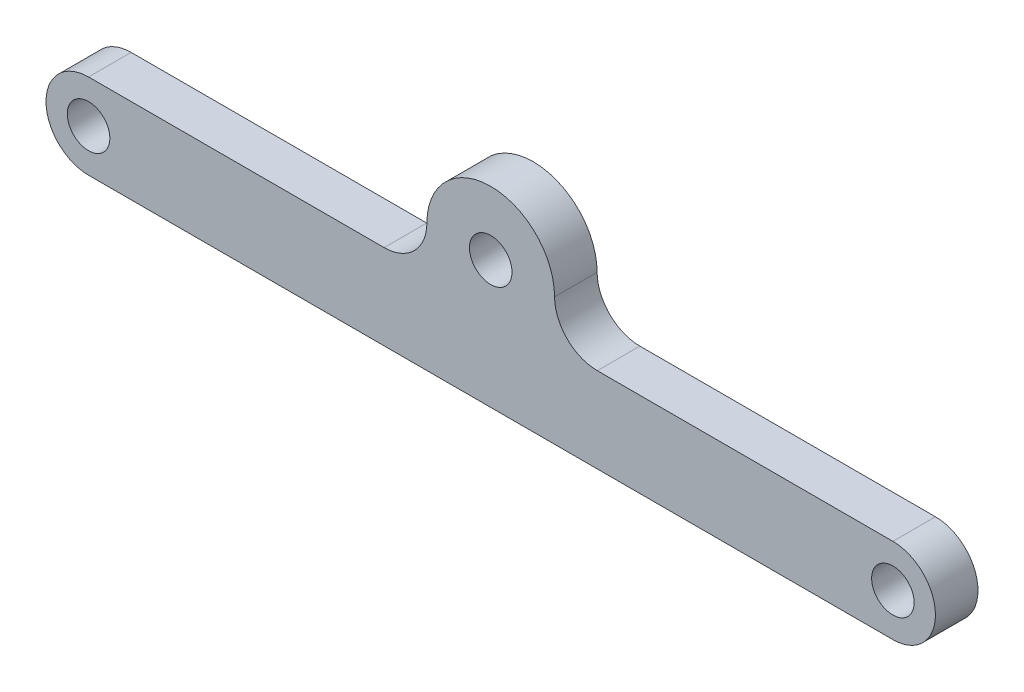
ISO-10303-21;
HEADER;
FILE_DESCRIPTION(('STEP AP214'),'2;1');
FILE_NAME('part.step','',(''),(''),'','','');
FILE_SCHEMA(('AUTOMOTIVE_DESIGN { 1 0 10303 214 1 1 1 1 }'));
ENDSEC;
DATA;
#1=APPLICATION_CONTEXT('core data for automotive mechanical design processes');
#2=APPLICATION_PROTOCOL_DEFINITION('international standard','automotive_design',2000,#1);
#3=PRODUCT_CONTEXT('',#1,'mechanical');
#4=PRODUCT('Part','Part','',(#3));
#5=PRODUCT_RELATED_PRODUCT_CATEGORY('part','',(#4));
#6=PRODUCT_DEFINITION_FORMATION('','',#4);
#7=PRODUCT_DEFINITION_CONTEXT('part definition',#1,'design');
#8=PRODUCT_DEFINITION('design','',#6,#7);
#9=PRODUCT_DEFINITION_SHAPE('','',#8);
#10=(LENGTH_UNIT() NAMED_UNIT(*) SI_UNIT(.MILLI.,.METRE.));
#11=(NAMED_UNIT(*) PLANE_ANGLE_UNIT() SI_UNIT($,.RADIAN.));
#12=(NAMED_UNIT(*) SI_UNIT($,.STERADIAN.) SOLID_ANGLE_UNIT());
#13=UNCERTAINTY_MEASURE_WITH_UNIT(LENGTH_MEASURE(1.E-05),#10,'distance_accuracy_value','');
#14=(GEOMETRIC_REPRESENTATION_CONTEXT(3) GLOBAL_UNCERTAINTY_ASSIGNED_CONTEXT((#13)) GLOBAL_UNIT_ASSIGNED_CONTEXT((#10,
#11,#12)) REPRESENTATION_CONTEXT('',''));
#15=CARTESIAN_POINT('',(0.,0.,0.));
#16=DIRECTION('',(0.,0.,1.));
#17=DIRECTION('',(1.,0.,0.));
#18=AXIS2_PLACEMENT_3D('',#15,#16,#17);
#19=CARTESIAN_POINT('',(31.8097299316788,25.45987039092,12.7));
#20=DIRECTION('',(0.,0.,1.));
#21=DIRECTION('',(1.,0.,0.));
#22=AXIS2_PLACEMENT_3D('',#19,#20,#21);
#23=PLANE('',#22);
#24=CARTESIAN_POINT('',(120.015,0.,12.7));
#25=DIRECTION('',(0.,0.,1.));
#26=DIRECTION('',(1.,0.,0.));
#27=AXIS2_PLACEMENT_3D('',#24,#25,#26);
#28=CIRCLE('',#27,6.35);
#29=CARTESIAN_POINT('',(126.365,0.,12.7));
#30=VERTEX_POINT('',#29);
#31=EDGE_CURVE('E217',#30,#30,#28,.T.);
#32=ORIENTED_EDGE('',*,*,#31,.F.);
#33=EDGE_LOOP('',(#32));
#34=FACE_BOUND('',#33,.T.);
#35=CARTESIAN_POINT('',(31.8097299316788,25.45987039092,12.7));
#36=DIRECTION('',(0.,0.,-1.));
#37=DIRECTION('',(1.,0.,0.));
#38=AXIS2_PLACEMENT_3D('',#35,#36,#37);
#39=CIRCLE('',#38,12.7598703909204);
#40=CARTESIAN_POINT('',(31.8097331654699,12.7,12.7));
#41=VERTEX_POINT('',#40);
#42=CARTESIAN_POINT('',(19.05,25.3999999999999,12.7));
#43=VERTEX_POINT('',#42);
#44=EDGE_CURVE('E168',#41,#43,#39,.T.);
#45=ORIENTED_EDGE('',*,*,#44,.T.);
#46=CARTESIAN_POINT('',(0.,25.4,12.7));
#47=DIRECTION('',(0.,0.,1.));
#48=DIRECTION('',(1.,0.,0.));
#49=AXIS2_PLACEMENT_3D('',#46,#47,#48);
#50=CIRCLE('',#49,19.05);
#51=CARTESIAN_POINT('',(-19.05,25.3999999999999,12.7));
#52=VERTEX_POINT('',#51);
#53=EDGE_CURVE('E104',#43,#52,#50,.T.);
#54=ORIENTED_EDGE('',*,*,#53,.T.);
#55=CARTESIAN_POINT('',(-31.8097299316788,25.45987039092,12.7));
#56=DIRECTION('',(0.,0.,-1.));
#57=DIRECTION('',(-1.,0.,0.));
#58=AXIS2_PLACEMENT_3D('',#55,#56,#57);
#59=CIRCLE('',#58,12.7598703909204);
#60=CARTESIAN_POINT('',(-31.8097331654699,12.7,12.7));
#61=VERTEX_POINT('',#60);
#62=EDGE_CURVE('E189',#52,#61,#59,.T.);
#63=ORIENTED_EDGE('',*,*,#62,.T.);
#64=DIRECTION('',(-1.,0.,0.));
#65=VECTOR('',#64,1.);
#66=CARTESIAN_POINT('',(-120.015,12.7,12.7));
#67=LINE('',#66,#65);
#68=CARTESIAN_POINT('',(-120.015,12.7,12.7));
#69=VERTEX_POINT('',#68);
#70=EDGE_CURVE('E203',#61,#69,#67,.T.);
#71=ORIENTED_EDGE('',*,*,#70,.T.);
#72=CARTESIAN_POINT('',(-120.015,0.,12.7));
#73=DIRECTION('',(0.,0.,1.));
#74=DIRECTION('',(1.,0.,0.));
#75=AXIS2_PLACEMENT_3D('',#72,#73,#74);
#76=CIRCLE('',#75,12.7);
#77=CARTESIAN_POINT('',(-120.015,-12.7,12.7));
#78=VERTEX_POINT('',#77);
#79=EDGE_CURVE('E123',#69,#78,#76,.T.);
#80=ORIENTED_EDGE('',*,*,#79,.T.);
#81=DIRECTION('',(1.,0.,0.));
#82=VECTOR('',#81,1.);
#83=CARTESIAN_POINT('',(-120.015,-12.7,12.7));
#84=LINE('',#83,#82);
#85=CARTESIAN_POINT('',(120.015,-12.6999999999999,12.7));
#86=VERTEX_POINT('',#85);
#87=EDGE_CURVE('E117',#78,#86,#84,.T.);
#88=ORIENTED_EDGE('',*,*,#87,.T.);
#89=CARTESIAN_POINT('',(120.015,0.,12.7));
#90=DIRECTION('',(0.,0.,1.));
#91=DIRECTION('',(1.,0.,0.));
#92=AXIS2_PLACEMENT_3D('',#89,#90,#91);
#93=CIRCLE('',#92,12.7);
#94=CARTESIAN_POINT('',(120.015,12.7,12.7));
#95=VERTEX_POINT('',#94);
#96=EDGE_CURVE('E121',#86,#95,#93,.T.);
#97=ORIENTED_EDGE('',*,*,#96,.T.);
#98=DIRECTION('',(-1.,0.,0.));
#99=VECTOR('',#98,1.);
#100=CARTESIAN_POINT('',(31.8097331654699,12.7,12.7));
#101=LINE('',#100,#99);
#102=EDGE_CURVE('E61',#95,#41,#101,.T.);
#103=ORIENTED_EDGE('',*,*,#102,.T.);
#104=EDGE_LOOP('',(#45,#54,#63,#71,#80,#88,#97,#103));
#105=FACE_BOUND('',#104,.T.);
#106=CARTESIAN_POINT('',(-120.015,0.,12.7));
#107=DIRECTION('',(0.,0.,1.));
#108=DIRECTION('',(1.,0.,0.));
#109=AXIS2_PLACEMENT_3D('',#106,#107,#108);
#110=CIRCLE('',#109,6.35);
#111=CARTESIAN_POINT('',(-113.665,0.,12.7));
#112=VERTEX_POINT('',#111);
#113=EDGE_CURVE('E150',#112,#112,#110,.T.);
#114=ORIENTED_EDGE('',*,*,#113,.F.);
#115=EDGE_LOOP('',(#114));
#116=FACE_BOUND('',#115,.T.);
#117=CARTESIAN_POINT('',(0.,25.4,12.7));
#118=DIRECTION('',(0.,0.,1.));
#119=DIRECTION('',(1.,0.,0.));
#120=AXIS2_PLACEMENT_3D('',#117,#118,#119);
#121=CIRCLE('',#120,6.35);
#122=CARTESIAN_POINT('',(6.35,25.4,12.7));
#123=VERTEX_POINT('',#122);
#124=EDGE_CURVE('E225',#123,#123,#121,.T.);
#125=ORIENTED_EDGE('',*,*,#124,.F.);
#126=EDGE_LOOP('',(#125));
#127=FACE_BOUND('',#126,.T.);
#128=ADVANCED_FACE('F43',(#34,#105,#116,#127),#23,.T.);
#129=CARTESIAN_POINT('',(31.8097299316788,25.45987039092,0.));
#130=DIRECTION('',(0.,0.,1.));
#131=DIRECTION('',(1.,0.,0.));
#132=AXIS2_PLACEMENT_3D('',#129,#130,#131);
#133=PLANE('',#132);
#134=CARTESIAN_POINT('',(31.8097299316788,25.45987039092,0.));
#135=DIRECTION('',(0.,0.,-1.));
#136=DIRECTION('',(1.,0.,0.));
#137=AXIS2_PLACEMENT_3D('',#134,#135,#136);
#138=CIRCLE('',#137,12.7598703909204);
#139=CARTESIAN_POINT('',(31.8097331654699,12.7,0.));
#140=VERTEX_POINT('',#139);
#141=CARTESIAN_POINT('',(19.05,25.3999999999999,0.));
#142=VERTEX_POINT('',#141);
#143=EDGE_CURVE('E145',#140,#142,#138,.T.);
#144=ORIENTED_EDGE('',*,*,#143,.F.);
#145=DIRECTION('',(-1.,0.,0.));
#146=VECTOR('',#145,1.);
#147=CARTESIAN_POINT('',(31.8097331654699,12.7,0.));
#148=LINE('',#147,#146);
#149=CARTESIAN_POINT('',(120.015,12.7,0.));
#150=VERTEX_POINT('',#149);
#151=EDGE_CURVE('E96',#150,#140,#148,.T.);
#152=ORIENTED_EDGE('',*,*,#151,.F.);
#153=CARTESIAN_POINT('',(120.015,0.,0.));
#154=DIRECTION('',(0.,0.,1.));
#155=DIRECTION('',(1.,0.,0.));
#156=AXIS2_PLACEMENT_3D('',#153,#154,#155);
#157=CIRCLE('',#156,12.7);
#158=CARTESIAN_POINT('',(120.015,-12.6999999999999,0.));
#159=VERTEX_POINT('',#158);
#160=EDGE_CURVE('E90',#159,#150,#157,.T.);
#161=ORIENTED_EDGE('',*,*,#160,.F.);
#162=DIRECTION('',(1.,0.,0.));
#163=VECTOR('',#162,1.);
#164=CARTESIAN_POINT('',(-120.015,-12.7,0.));
#165=LINE('',#164,#163);
#166=CARTESIAN_POINT('',(-120.015,-12.7,0.));
#167=VERTEX_POINT('',#166);
#168=EDGE_CURVE('E132',#167,#159,#165,.T.);
#169=ORIENTED_EDGE('',*,*,#168,.F.);
#170=CARTESIAN_POINT('',(-120.015,0.,0.));
#171=DIRECTION('',(0.,0.,1.));
#172=DIRECTION('',(1.,0.,0.));
#173=AXIS2_PLACEMENT_3D('',#170,#171,#172);
#174=CIRCLE('',#173,12.7);
#175=CARTESIAN_POINT('',(-120.015,12.7,0.));
#176=VERTEX_POINT('',#175);
#177=EDGE_CURVE('E159',#176,#167,#174,.T.);
#178=ORIENTED_EDGE('',*,*,#177,.F.);
#179=DIRECTION('',(-1.,0.,0.));
#180=VECTOR('',#179,1.);
#181=CARTESIAN_POINT('',(-120.015,12.7,0.));
#182=LINE('',#181,#180);
#183=CARTESIAN_POINT('',(-31.8097331654699,12.7,0.));
#184=VERTEX_POINT('',#183);
#185=EDGE_CURVE('E156',#184,#176,#182,.T.);
#186=ORIENTED_EDGE('',*,*,#185,.F.);
#187=CARTESIAN_POINT('',(-31.8097299316788,25.45987039092,0.));
#188=DIRECTION('',(0.,0.,-1.));
#189=DIRECTION('',(-1.,0.,0.));
#190=AXIS2_PLACEMENT_3D('',#187,#188,#189);
#191=CIRCLE('',#190,12.7598703909204);
#192=CARTESIAN_POINT('',(-19.05,25.3999999999999,0.));
#193=VERTEX_POINT('',#192);
#194=EDGE_CURVE('E153',#193,#184,#191,.T.);
#195=ORIENTED_EDGE('',*,*,#194,.F.);
#196=CARTESIAN_POINT('',(0.,25.4,0.));
#197=DIRECTION('',(0.,0.,1.));
#198=DIRECTION('',(1.,0.,0.));
#199=AXIS2_PLACEMENT_3D('',#196,#197,#198);
#200=CIRCLE('',#199,19.05);
#201=EDGE_CURVE('E149',#142,#193,#200,.T.);
#202=ORIENTED_EDGE('',*,*,#201,.F.);
#203=EDGE_LOOP('',(#144,#152,#161,#169,#178,#186,#195,#202));
#204=FACE_BOUND('',#203,.T.);
#205=CARTESIAN_POINT('',(-120.015,0.,0.));
#206=DIRECTION('',(0.,0.,1.));
#207=DIRECTION('',(1.,0.,0.));
#208=AXIS2_PLACEMENT_3D('',#205,#206,#207);
#209=CIRCLE('',#208,6.35);
#210=CARTESIAN_POINT('',(-113.665,0.,0.));
#211=VERTEX_POINT('',#210);
#212=EDGE_CURVE('E213',#211,#211,#209,.T.);
#213=ORIENTED_EDGE('',*,*,#212,.T.);
#214=EDGE_LOOP('',(#213));
#215=FACE_BOUND('',#214,.T.);
#216=CARTESIAN_POINT('',(120.015,0.,0.));
#217=DIRECTION('',(0.,0.,1.));
#218=DIRECTION('',(1.,0.,0.));
#219=AXIS2_PLACEMENT_3D('',#216,#217,#218);
#220=CIRCLE('',#219,6.35);
#221=CARTESIAN_POINT('',(126.365,0.,0.));
#222=VERTEX_POINT('',#221);
#223=EDGE_CURVE('E221',#222,#222,#220,.T.);
#224=ORIENTED_EDGE('',*,*,#223,.T.);
#225=EDGE_LOOP('',(#224));
#226=FACE_BOUND('',#225,.T.);
#227=CARTESIAN_POINT('',(0.,25.4,0.));
#228=DIRECTION('',(0.,0.,1.));
#229=DIRECTION('',(1.,0.,0.));
#230=AXIS2_PLACEMENT_3D('',#227,#228,#229);
#231=CIRCLE('',#230,6.35);
#232=CARTESIAN_POINT('',(6.35,25.4,0.));
#233=VERTEX_POINT('',#232);
#234=EDGE_CURVE('E229',#233,#233,#231,.T.);
#235=ORIENTED_EDGE('',*,*,#234,.T.);
#236=EDGE_LOOP('',(#235));
#237=FACE_BOUND('',#236,.T.);
#238=ADVANCED_FACE('F193',(#204,#215,#226,#237),#133,.F.);
#239=CARTESIAN_POINT('',(31.8097299316788,25.45987039092,12.7));
#240=DIRECTION('',(0.,0.,-1.));
#241=DIRECTION('',(-1.,0.,0.));
#242=AXIS2_PLACEMENT_3D('',#239,#240,#241);
#243=CYLINDRICAL_SURFACE('',#242,12.7598703909204);
#244=ORIENTED_EDGE('',*,*,#143,.T.);
#245=DIRECTION('',(0.,0.,-1.));
#246=VECTOR('',#245,1.);
#247=CARTESIAN_POINT('',(19.05,25.3999999999999,12.7));
#248=LINE('',#247,#246);
#249=EDGE_CURVE('E11',#43,#142,#248,.T.);
#250=ORIENTED_EDGE('',*,*,#249,.F.);
#251=ORIENTED_EDGE('',*,*,#44,.F.);
#252=DIRECTION('',(0.,0.,-1.));
#253=VECTOR('',#252,1.);
#254=CARTESIAN_POINT('',(31.8097331654699,12.7,12.7));
#255=LINE('',#254,#253);
#256=EDGE_CURVE('E141',#41,#140,#255,.T.);
#257=ORIENTED_EDGE('',*,*,#256,.T.);
#258=EDGE_LOOP('',(#244,#250,#251,#257));
#259=FACE_BOUND('',#258,.T.);
#260=ADVANCED_FACE('F45',(#259),#243,.F.);
#261=CARTESIAN_POINT('',(0.,25.4,12.7));
#262=DIRECTION('',(0.,0.,-1.));
#263=DIRECTION('',(-1.,0.,0.));
#264=AXIS2_PLACEMENT_3D('',#261,#262,#263);
#265=CYLINDRICAL_SURFACE('',#264,19.05);
#266=ORIENTED_EDGE('',*,*,#201,.T.);
#267=DIRECTION('',(0.,0.,-1.));
#268=VECTOR('',#267,1.);
#269=CARTESIAN_POINT('',(-19.05,25.3999999999999,12.7));
#270=LINE('',#269,#268);
#271=EDGE_CURVE('E53',#52,#193,#270,.T.);
#272=ORIENTED_EDGE('',*,*,#271,.F.);
#273=ORIENTED_EDGE('',*,*,#53,.F.);
#274=ORIENTED_EDGE('',*,*,#249,.T.);
#275=EDGE_LOOP('',(#266,#272,#273,#274));
#276=FACE_BOUND('',#275,.T.);
#277=ADVANCED_FACE('F264',(#276),#265,.T.);
#278=CARTESIAN_POINT('',(-31.8097299316788,25.45987039092,12.7));
#279=DIRECTION('',(0.,0.,-1.));
#280=DIRECTION('',(-1.,0.,0.));
#281=AXIS2_PLACEMENT_3D('',#278,#279,#280);
#282=CYLINDRICAL_SURFACE('',#281,12.7598703909204);
#283=ORIENTED_EDGE('',*,*,#194,.T.);
#284=DIRECTION('',(0.,0.,-1.));
#285=VECTOR('',#284,1.);
#286=CARTESIAN_POINT('',(-31.8097331654699,12.7,12.7));
#287=LINE('',#286,#285);
#288=EDGE_CURVE('E179',#61,#184,#287,.T.);
#289=ORIENTED_EDGE('',*,*,#288,.F.);
#290=ORIENTED_EDGE('',*,*,#62,.F.);
#291=ORIENTED_EDGE('',*,*,#271,.T.);
#292=EDGE_LOOP('',(#283,#289,#290,#291));
#293=FACE_BOUND('',#292,.T.);
#294=ADVANCED_FACE('F187',(#293),#282,.F.);
#295=CARTESIAN_POINT('',(-120.015,12.7,12.7));
#296=DIRECTION('',(0.,-1.,0.));
#297=DIRECTION('',(1.,0.,0.));
#298=AXIS2_PLACEMENT_3D('',#295,#296,#297);
#299=PLANE('',#298);
#300=ORIENTED_EDGE('',*,*,#185,.T.);
#301=DIRECTION('',(0.,0.,-1.));
#302=VECTOR('',#301,1.);
#303=CARTESIAN_POINT('',(-120.015,12.7,12.7));
#304=LINE('',#303,#302);
#305=EDGE_CURVE('E175',#69,#176,#304,.T.);
#306=ORIENTED_EDGE('',*,*,#305,.F.);
#307=ORIENTED_EDGE('',*,*,#70,.F.);
#308=ORIENTED_EDGE('',*,*,#288,.T.);
#309=EDGE_LOOP('',(#300,#306,#307,#308));
#310=FACE_BOUND('',#309,.T.);
#311=ADVANCED_FACE('F198',(#310),#299,.F.);
#312=CARTESIAN_POINT('',(-120.015,0.,12.7));
#313=DIRECTION('',(0.,0.,-1.));
#314=DIRECTION('',(-1.,0.,0.));
#315=AXIS2_PLACEMENT_3D('',#312,#313,#314);
#316=CYLINDRICAL_SURFACE('',#315,12.7);
#317=ORIENTED_EDGE('',*,*,#177,.T.);
#318=DIRECTION('',(0.,0.,-1.));
#319=VECTOR('',#318,1.);
#320=CARTESIAN_POINT('',(-120.015,-12.7,12.7));
#321=LINE('',#320,#319);
#322=EDGE_CURVE('E134',#78,#167,#321,.T.);
#323=ORIENTED_EDGE('',*,*,#322,.F.);
#324=ORIENTED_EDGE('',*,*,#79,.F.);
#325=ORIENTED_EDGE('',*,*,#305,.T.);
#326=EDGE_LOOP('',(#317,#323,#324,#325));
#327=FACE_BOUND('',#326,.T.);
#328=ADVANCED_FACE('F201',(#327),#316,.T.);
#329=CARTESIAN_POINT('',(-120.015,-12.7,12.7));
#330=DIRECTION('',(0.,1.,0.));
#331=DIRECTION('',(-1.,0.,0.));
#332=AXIS2_PLACEMENT_3D('',#329,#330,#331);
#333=PLANE('',#332);
#334=ORIENTED_EDGE('',*,*,#168,.T.);
#335=DIRECTION('',(0.,0.,-1.));
#336=VECTOR('',#335,1.);
#337=CARTESIAN_POINT('',(120.015,-12.6999999999999,12.7));
#338=LINE('',#337,#336);
#339=EDGE_CURVE('E129',#86,#159,#338,.T.);
#340=ORIENTED_EDGE('',*,*,#339,.F.);
#341=ORIENTED_EDGE('',*,*,#87,.F.);
#342=ORIENTED_EDGE('',*,*,#322,.T.);
#343=EDGE_LOOP('',(#334,#340,#341,#342));
#344=FACE_BOUND('',#343,.T.);
#345=ADVANCED_FACE('F130',(#344),#333,.F.);
#346=CARTESIAN_POINT('',(120.015,0.,12.7));
#347=DIRECTION('',(0.,0.,-1.));
#348=DIRECTION('',(-1.,0.,0.));
#349=AXIS2_PLACEMENT_3D('',#346,#347,#348);
#350=CYLINDRICAL_SURFACE('',#349,12.7);
#351=ORIENTED_EDGE('',*,*,#160,.T.);
#352=DIRECTION('',(0.,0.,-1.));
#353=VECTOR('',#352,1.);
#354=CARTESIAN_POINT('',(120.015,12.7,12.7));
#355=LINE('',#354,#353);
#356=EDGE_CURVE('E135',#95,#150,#355,.T.);
#357=ORIENTED_EDGE('',*,*,#356,.F.);
#358=ORIENTED_EDGE('',*,*,#96,.F.);
#359=ORIENTED_EDGE('',*,*,#339,.T.);
#360=EDGE_LOOP('',(#351,#357,#358,#359));
#361=FACE_BOUND('',#360,.T.);
#362=ADVANCED_FACE('F137',(#361),#350,.T.);
#363=CARTESIAN_POINT('',(31.8097331654699,12.7,12.7));
#364=DIRECTION('',(0.,-1.,0.));
#365=DIRECTION('',(1.,0.,0.));
#366=AXIS2_PLACEMENT_3D('',#363,#364,#365);
#367=PLANE('',#366);
#368=ORIENTED_EDGE('',*,*,#151,.T.);
#369=ORIENTED_EDGE('',*,*,#256,.F.);
#370=ORIENTED_EDGE('',*,*,#102,.F.);
#371=ORIENTED_EDGE('',*,*,#356,.T.);
#372=EDGE_LOOP('',(#368,#369,#370,#371));
#373=FACE_BOUND('',#372,.T.);
#374=ADVANCED_FACE('F252',(#373),#367,.F.);
#375=CARTESIAN_POINT('',(-120.015,0.,12.7));
#376=DIRECTION('',(0.,0.,-1.));
#377=DIRECTION('',(-1.,0.,0.));
#378=AXIS2_PLACEMENT_3D('',#375,#376,#377);
#379=CYLINDRICAL_SURFACE('',#378,6.35);
#380=ORIENTED_EDGE('',*,*,#113,.T.);
#381=EDGE_LOOP('',(#380));
#382=FACE_BOUND('',#381,.T.);
#383=ORIENTED_EDGE('',*,*,#212,.F.);
#384=EDGE_LOOP('',(#383));
#385=FACE_BOUND('',#384,.T.);
#386=ADVANCED_FACE('F249',(#382,#385),#379,.F.);
#387=CARTESIAN_POINT('',(120.015,0.,12.7));
#388=DIRECTION('',(0.,0.,-1.));
#389=DIRECTION('',(-1.,0.,0.));
#390=AXIS2_PLACEMENT_3D('',#387,#388,#389);
#391=CYLINDRICAL_SURFACE('',#390,6.35);
#392=ORIENTED_EDGE('',*,*,#31,.T.);
#393=EDGE_LOOP('',(#392));
#394=FACE_BOUND('',#393,.T.);
#395=ORIENTED_EDGE('',*,*,#223,.F.);
#396=EDGE_LOOP('',(#395));
#397=FACE_BOUND('',#396,.T.);
#398=ADVANCED_FACE('F340',(#394,#397),#391,.F.);
#399=CARTESIAN_POINT('',(0.,25.4,12.7));
#400=DIRECTION('',(0.,0.,-1.));
#401=DIRECTION('',(-1.,0.,0.));
#402=AXIS2_PLACEMENT_3D('',#399,#400,#401);
#403=CYLINDRICAL_SURFACE('',#402,6.35);
#404=ORIENTED_EDGE('',*,*,#124,.T.);
#405=EDGE_LOOP('',(#404));
#406=FACE_BOUND('',#405,.T.);
#407=ORIENTED_EDGE('',*,*,#234,.F.);
#408=EDGE_LOOP('',(#407));
#409=FACE_BOUND('',#408,.T.);
#410=ADVANCED_FACE('F237',(#406,#409),#403,.F.);
#411=CLOSED_SHELL('',(#128,#238,#260,#277,#294,#311,#328,#345,#362,#374,#386,#398,#410));
#412=MANIFOLD_SOLID_BREP('B2',#411);
#413=ADVANCED_BREP_SHAPE_REPRESENTATION('',(#18,#412),#14);
#414=SHAPE_DEFINITION_REPRESENTATION(#9,#413);
ENDSEC;
END-ISO-10303-21;
